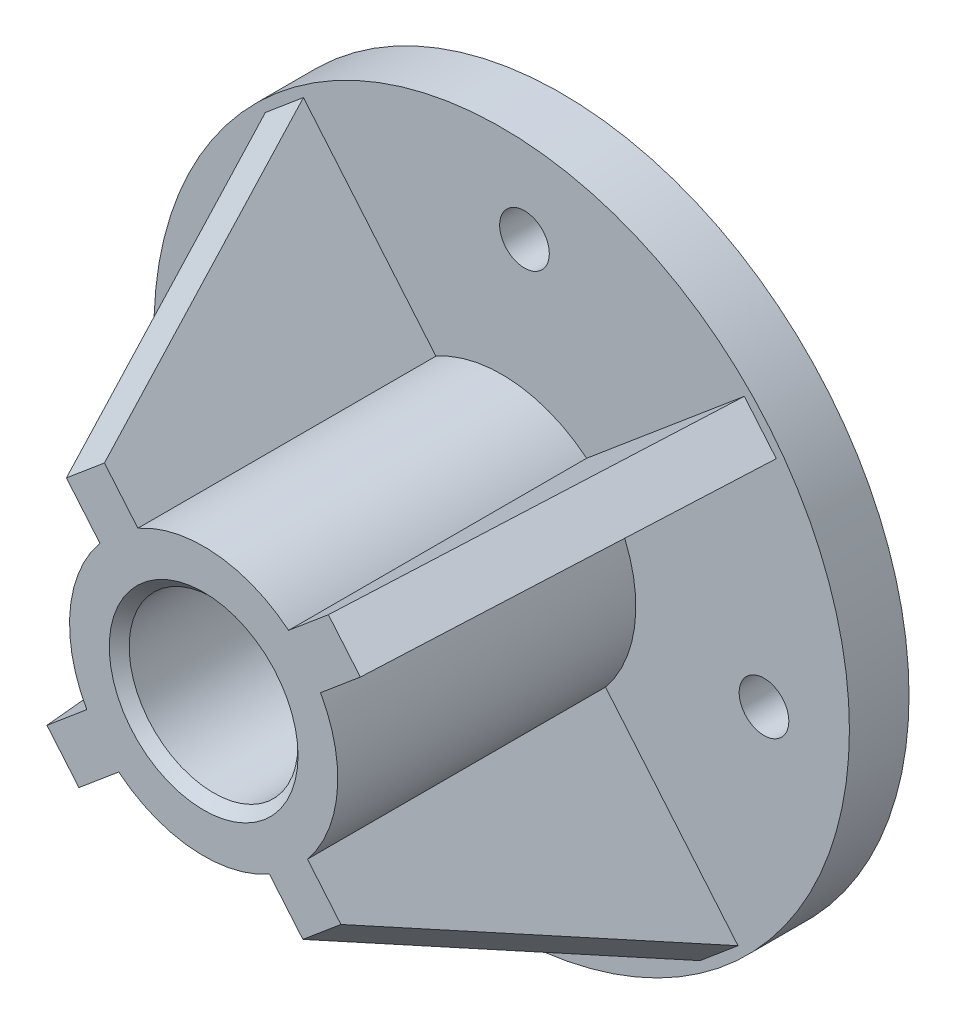
ISO-10303-21;
HEADER;
FILE_DESCRIPTION(('STEP AP214'),'2;1');
FILE_NAME('part.step','',(''),(''),'','','');
FILE_SCHEMA(('AUTOMOTIVE_DESIGN { 1 0 10303 214 1 1 1 1 }'));
ENDSEC;
DATA;
#1=APPLICATION_CONTEXT('core data for automotive mechanical design processes');
#2=APPLICATION_PROTOCOL_DEFINITION('international standard','automotive_design',2000,#1);
#3=PRODUCT_CONTEXT('',#1,'mechanical');
#4=PRODUCT('Part','Part','',(#3));
#5=PRODUCT_RELATED_PRODUCT_CATEGORY('part','',(#4));
#6=PRODUCT_DEFINITION_FORMATION('','',#4);
#7=PRODUCT_DEFINITION_CONTEXT('part definition',#1,'design');
#8=PRODUCT_DEFINITION('design','',#6,#7);
#9=PRODUCT_DEFINITION_SHAPE('','',#8);
#10=(LENGTH_UNIT() NAMED_UNIT(*) SI_UNIT(.MILLI.,.METRE.));
#11=(NAMED_UNIT(*) PLANE_ANGLE_UNIT() SI_UNIT($,.RADIAN.));
#12=(NAMED_UNIT(*) SI_UNIT($,.STERADIAN.) SOLID_ANGLE_UNIT());
#13=UNCERTAINTY_MEASURE_WITH_UNIT(LENGTH_MEASURE(1.E-05),#10,'distance_accuracy_value','');
#14=(GEOMETRIC_REPRESENTATION_CONTEXT(3) GLOBAL_UNCERTAINTY_ASSIGNED_CONTEXT((#13)) GLOBAL_UNIT_ASSIGNED_CONTEXT((#10,
#11,#12)) REPRESENTATION_CONTEXT('',''));
#15=CARTESIAN_POINT('',(0.,0.,0.));
#16=DIRECTION('',(0.,0.,1.));
#17=DIRECTION('',(1.,0.,0.));
#18=AXIS2_PLACEMENT_3D('',#15,#16,#17);
#19=CARTESIAN_POINT('',(-80.4513071380661,19.9438114333861,6.));
#20=DIRECTION('',(0.,0.,1.));
#21=DIRECTION('',(1.,0.,0.));
#22=AXIS2_PLACEMENT_3D('',#19,#20,#21);
#23=PLANE('',#22);
#24=CARTESIAN_POINT('',(-78.159933960489,46.3445615924456,6.));
#25=DIRECTION('',(0.,0.,1.));
#26=DIRECTION('',(0.,-1.,0.));
#27=AXIS2_PLACEMENT_3D('',#24,#25,#26);
#28=CIRCLE('',#27,2.5);
#29=CARTESIAN_POINT('',(-78.1599339604891,43.8445615924456,6.));
#30=VERTEX_POINT('',#29);
#31=EDGE_CURVE('E195',#30,#30,#28,.T.);
#32=ORIENTED_EDGE('',*,*,#31,.F.);
#33=EDGE_LOOP('',(#32));
#34=FACE_BOUND('',#33,.T.);
#35=CARTESIAN_POINT('',(-54.0505569790066,17.6524382558091,6.));
#36=DIRECTION('',(0.,0.,1.));
#37=DIRECTION('',(-1.,0.,0.));
#38=AXIS2_PLACEMENT_3D('',#35,#36,#37);
#39=CIRCLE('',#38,2.5);
#40=CARTESIAN_POINT('',(-56.5505569790066,17.6524382558091,6.));
#41=VERTEX_POINT('',#40);
#42=EDGE_CURVE('E577',#41,#41,#39,.T.);
#43=ORIENTED_EDGE('',*,*,#42,.F.);
#44=EDGE_LOOP('',(#43));
#45=FACE_BOUND('',#44,.T.);
#46=CARTESIAN_POINT('',(-82.7426803156434,-6.45693872567335,6.));
#47=DIRECTION('',(0.,0.,1.));
#48=DIRECTION('',(0.,1.,0.));
#49=AXIS2_PLACEMENT_3D('',#46,#47,#48);
#50=CIRCLE('',#49,2.5);
#51=CARTESIAN_POINT('',(-82.7426803156434,-3.95693872567335,6.));
#52=VERTEX_POINT('',#51);
#53=EDGE_CURVE('E208',#52,#52,#50,.T.);
#54=ORIENTED_EDGE('',*,*,#53,.F.);
#55=EDGE_LOOP('',(#54));
#56=FACE_BOUND('',#55,.T.);
#57=CARTESIAN_POINT('',(-106.852057297126,22.2351846109631,6.));
#58=DIRECTION('',(0.,0.,1.));
#59=DIRECTION('',(1.,0.,0.));
#60=AXIS2_PLACEMENT_3D('',#57,#58,#59);
#61=CIRCLE('',#60,2.5);
#62=CARTESIAN_POINT('',(-104.352057297126,22.2351846109631,6.));
#63=VERTEX_POINT('',#62);
#64=EDGE_CURVE('E191',#63,#63,#61,.T.);
#65=ORIENTED_EDGE('',*,*,#64,.F.);
#66=EDGE_LOOP('',(#65));
#67=FACE_BOUND('',#66,.T.);
#68=CARTESIAN_POINT('',(-80.4513071380661,19.9438114333861,6.));
#69=DIRECTION('',(0.,0.,1.));
#70=DIRECTION('',(1.,0.,0.));
#71=AXIS2_PLACEMENT_3D('',#68,#69,#70);
#72=CIRCLE('',#71,35.);
#73=CARTESIAN_POINT('',(-45.4513071380661,19.9438114333861,6.));
#74=VERTEX_POINT('',#73);
#75=EDGE_CURVE('E277',#74,#74,#72,.T.);
#76=ORIENTED_EDGE('',*,*,#75,.T.);
#77=EDGE_LOOP('',(#76));
#78=FACE_BOUND('',#77,.T.);
#79=DIRECTION('',(-0.643317130331662,0.765599810489681,0.));
#80=VECTOR('',#79,1.);
#81=CARTESIAN_POINT('',(-52.8126207555878,39.9025943384384,6.));
#82=LINE('',#81,#80);
#83=CARTESIAN_POINT('',(-52.8126207555878,39.9025943384384,6.));
#84=VERTEX_POINT('',#83);
#85=CARTESIAN_POINT('',(-56.0292064072461,43.7305933908868,6.));
#86=VERTEX_POINT('',#85);
#87=EDGE_CURVE('E171',#84,#86,#82,.T.);
#88=ORIENTED_EDGE('',*,*,#87,.F.);
#89=DIRECTION('',(0.765599810489681,0.643317130331662,0.));
#90=VECTOR('',#89,1.);
#91=CARTESIAN_POINT('',(-70.1198582657561,25.3596931824303,6.));
#92=LINE('',#91,#90);
#93=CARTESIAN_POINT('',(-68.6861850683911,26.5643780772351,6.));
#94=VERTEX_POINT('',#93);
#95=EDGE_CURVE('E163',#94,#84,#92,.T.);
#96=ORIENTED_EDGE('',*,*,#95,.F.);
#97=CARTESIAN_POINT('',(-80.4513071380661,19.9438114333861,6.));
#98=DIRECTION('',(0.,0.,1.));
#99=DIRECTION('',(1.,0.,0.));
#100=AXIS2_PLACEMENT_3D('',#97,#98,#99);
#101=CIRCLE('',#100,13.5);
#102=CARTESIAN_POINT('',(-70.0027414417687,11.3952750153695,6.));
#103=VERTEX_POINT('',#102);
#104=EDGE_CURVE('E274',#103,#94,#101,.T.);
#105=ORIENTED_EDGE('',*,*,#104,.F.);
#106=DIRECTION('',(-0.64331713033167,0.765599810489675,0.));
#107=VECTOR('',#106,1.);
#108=CARTESIAN_POINT('',(-71.2074263365734,12.8289482127345,6.));
#109=LINE('',#108,#107);
#110=CARTESIAN_POINT('',(-56.6645251805652,-4.47828929743362,6.));
#111=VERTEX_POINT('',#110);
#112=EDGE_CURVE('E260',#111,#103,#109,.T.);
#113=ORIENTED_EDGE('',*,*,#112,.F.);
#114=DIRECTION('',(0.765599810489675,0.64331713033167,0.));
#115=VECTOR('',#114,1.);
#116=CARTESIAN_POINT('',(-60.4925242330135,-7.69487494909196,6.));
#117=LINE('',#116,#115);
#118=CARTESIAN_POINT('',(-60.4925242330135,-7.69487494909196,6.));
#119=VERTEX_POINT('',#118);
#120=EDGE_CURVE('E264',#119,#111,#117,.T.);
#121=ORIENTED_EDGE('',*,*,#120,.F.);
#122=DIRECTION('',(0.64331713033167,-0.765599810489674,0.));
#123=VECTOR('',#122,1.);
#124=CARTESIAN_POINT('',(-75.0354253890218,9.61236256107618,6.));
#125=LINE('',#124,#123);
#126=CARTESIAN_POINT('',(-73.8307404942171,8.17868936371117,6.));
#127=VERTEX_POINT('',#126);
#128=EDGE_CURVE('E255',#127,#119,#125,.T.);
#129=ORIENTED_EDGE('',*,*,#128,.F.);
#130=CARTESIAN_POINT('',(-88.9998435560828,9.49524573708873,6.));
#131=VERTEX_POINT('',#130);
#132=EDGE_CURVE('E262',#131,#127,#101,.T.);
#133=ORIENTED_EDGE('',*,*,#132,.F.);
#134=DIRECTION('',(0.765599810489677,0.643317130331667,0.));
#135=VECTOR('',#134,1.);
#136=CARTESIAN_POINT('',(-87.5661703587178,10.6999306318935,6.));
#137=LINE('',#136,#135);
#138=CARTESIAN_POINT('',(-104.873407868886,-3.84297052411475,6.));
#139=VERTEX_POINT('',#138);
#140=EDGE_CURVE('E242',#139,#131,#137,.T.);
#141=ORIENTED_EDGE('',*,*,#140,.F.);
#142=DIRECTION('',(0.643317130331667,-0.765599810489677,0.));
#143=VECTOR('',#142,1.);
#144=CARTESIAN_POINT('',(-108.089993520544,-0.0149714716663613,6.));
#145=LINE('',#144,#143);
#146=CARTESIAN_POINT('',(-108.089993520544,-0.0149714716663613,6.));
#147=VERTEX_POINT('',#146);
#148=EDGE_CURVE('E246',#147,#139,#145,.T.);
#149=ORIENTED_EDGE('',*,*,#148,.F.);
#150=DIRECTION('',(-0.765599810489677,-0.643317130331667,0.));
#151=VECTOR('',#150,1.);
#152=CARTESIAN_POINT('',(-90.7827560103761,14.5279296843419,6.));
#153=LINE('',#152,#151);
#154=CARTESIAN_POINT('',(-92.2164292077411,13.3232447895371,6.));
#155=VERTEX_POINT('',#154);
#156=EDGE_CURVE('E237',#155,#147,#153,.T.);
#157=ORIENTED_EDGE('',*,*,#156,.F.);
#158=CARTESIAN_POINT('',(-90.8998728343636,28.4923478514028,6.));
#159=VERTEX_POINT('',#158);
#160=EDGE_CURVE('E336',#159,#155,#101,.T.);
#161=ORIENTED_EDGE('',*,*,#160,.F.);
#162=DIRECTION('',(0.64331713033167,-0.765599810489675,0.));
#163=VECTOR('',#162,1.);
#164=CARTESIAN_POINT('',(-89.6951879395588,27.0586746540377,6.));
#165=LINE('',#164,#163);
#166=CARTESIAN_POINT('',(-104.238089095567,44.3659121642059,6.));
#167=VERTEX_POINT('',#166);
#168=EDGE_CURVE('E224',#167,#159,#165,.T.);
#169=ORIENTED_EDGE('',*,*,#168,.F.);
#170=DIRECTION('',(-0.765599810489675,-0.64331713033167,0.));
#171=VECTOR('',#170,1.);
#172=CARTESIAN_POINT('',(-100.410090043119,47.5824978158642,6.));
#173=LINE('',#172,#171);
#174=CARTESIAN_POINT('',(-100.410090043119,47.5824978158642,6.));
#175=VERTEX_POINT('',#174);
#176=EDGE_CURVE('E228',#175,#167,#173,.T.);
#177=ORIENTED_EDGE('',*,*,#176,.F.);
#178=DIRECTION('',(-0.64331713033167,0.765599810489674,0.));
#179=VECTOR('',#178,1.);
#180=CARTESIAN_POINT('',(-85.8671888871105,30.2752603056961,6.));
#181=LINE('',#180,#179);
#182=CARTESIAN_POINT('',(-87.0718737819152,31.7089335030611,6.));
#183=VERTEX_POINT('',#182);
#184=EDGE_CURVE('E219',#183,#175,#181,.T.);
#185=ORIENTED_EDGE('',*,*,#184,.F.);
#186=CARTESIAN_POINT('',(-71.9027707200494,30.3923771296835,6.));
#187=VERTEX_POINT('',#186);
#188=EDGE_CURVE('E276',#187,#183,#101,.T.);
#189=ORIENTED_EDGE('',*,*,#188,.F.);
#190=DIRECTION('',(-0.765599810489681,-0.643317130331662,0.));
#191=VECTOR('',#190,1.);
#192=CARTESIAN_POINT('',(-73.3364439174144,29.1876922348788,6.));
#193=LINE('',#192,#191);
#194=EDGE_CURVE('E176',#86,#187,#193,.T.);
#195=ORIENTED_EDGE('',*,*,#194,.F.);
#196=EDGE_LOOP('',(#88,#96,#105,#113,#121,#129,#133,#141,#149,#157,#161,#169,#177,#185,#189,#195));
#197=FACE_BOUND('',#196,.T.);
#198=ADVANCED_FACE('F49',(#34,#45,#56,#67,#78,#197),#23,.T.);
#199=CARTESIAN_POINT('',(-80.4513071380661,19.9438114333861,36.));
#200=DIRECTION('',(0.,0.,-1.));
#201=DIRECTION('',(-1.,0.,0.));
#202=AXIS2_PLACEMENT_3D('',#199,#200,#201);
#203=CYLINDRICAL_SURFACE('',#202,13.5);
#204=DIRECTION('',(0.,0.,-1.));
#205=VECTOR('',#204,1.);
#206=CARTESIAN_POINT('',(-68.6861850683911,26.5643780772351,36.));
#207=LINE('',#206,#205);
#208=CARTESIAN_POINT('',(-68.6861850683911,26.5643780772351,36.));
#209=VERTEX_POINT('',#208);
#210=EDGE_CURVE('E167',#209,#94,#207,.T.);
#211=ORIENTED_EDGE('',*,*,#210,.F.);
#212=CARTESIAN_POINT('',(-80.4513071380661,19.9438114333861,36.));
#213=DIRECTION('',(0.,0.,1.));
#214=DIRECTION('',(1.,0.,0.));
#215=AXIS2_PLACEMENT_3D('',#212,#213,#214);
#216=CIRCLE('',#215,13.5);
#217=CARTESIAN_POINT('',(-70.0027414417687,11.3952750153695,36.));
#218=VERTEX_POINT('',#217);
#219=EDGE_CURVE('E268',#218,#209,#216,.T.);
#220=ORIENTED_EDGE('',*,*,#219,.F.);
#221=DIRECTION('',(0.,0.,-1.));
#222=VECTOR('',#221,1.);
#223=CARTESIAN_POINT('',(-70.0027414417687,11.3952750153695,36.));
#224=LINE('',#223,#222);
#225=EDGE_CURVE('E280',#103,#218,#224,.F.);
#226=ORIENTED_EDGE('',*,*,#225,.F.);
#227=ORIENTED_EDGE('',*,*,#104,.T.);
#228=EDGE_LOOP('',(#211,#220,#226,#227));
#229=FACE_BOUND('',#228,.T.);
#230=ADVANCED_FACE('F374',(#229),#203,.T.);
#231=DIRECTION('',(0.,0.,-1.));
#232=VECTOR('',#231,1.);
#233=CARTESIAN_POINT('',(-71.9027707200494,30.3923771296835,36.));
#234=LINE('',#233,#232);
#235=CARTESIAN_POINT('',(-71.9027707200494,30.3923771296835,36.));
#236=VERTEX_POINT('',#235);
#237=EDGE_CURVE('E213',#187,#236,#234,.F.);
#238=ORIENTED_EDGE('',*,*,#237,.F.);
#239=ORIENTED_EDGE('',*,*,#188,.T.);
#240=DIRECTION('',(0.,0.,-1.));
#241=VECTOR('',#240,1.);
#242=CARTESIAN_POINT('',(-87.0718737819152,31.7089335030611,36.));
#243=LINE('',#242,#241);
#244=CARTESIAN_POINT('',(-87.0718737819152,31.7089335030611,36.));
#245=VERTEX_POINT('',#244);
#246=EDGE_CURVE('E234',#245,#183,#243,.T.);
#247=ORIENTED_EDGE('',*,*,#246,.F.);
#248=EDGE_CURVE('E272',#236,#245,#216,.T.);
#249=ORIENTED_EDGE('',*,*,#248,.F.);
#250=EDGE_LOOP('',(#238,#239,#247,#249));
#251=FACE_BOUND('',#250,.T.);
#252=ADVANCED_FACE('F317',(#251),#203,.T.);
#253=DIRECTION('',(0.,0.,-1.));
#254=VECTOR('',#253,1.);
#255=CARTESIAN_POINT('',(-90.8998728343636,28.4923478514028,36.));
#256=LINE('',#255,#254);
#257=CARTESIAN_POINT('',(-90.8998728343636,28.4923478514028,36.));
#258=VERTEX_POINT('',#257);
#259=EDGE_CURVE('E226',#159,#258,#256,.F.);
#260=ORIENTED_EDGE('',*,*,#259,.F.);
#261=ORIENTED_EDGE('',*,*,#160,.T.);
#262=DIRECTION('',(0.,0.,-1.));
#263=VECTOR('',#262,1.);
#264=CARTESIAN_POINT('',(-92.2164292077411,13.3232447895371,36.));
#265=LINE('',#264,#263);
#266=CARTESIAN_POINT('',(-92.2164292077411,13.3232447895371,36.));
#267=VERTEX_POINT('',#266);
#268=EDGE_CURVE('E252',#267,#155,#265,.T.);
#269=ORIENTED_EDGE('',*,*,#268,.F.);
#270=EDGE_CURVE('E319',#258,#267,#216,.T.);
#271=ORIENTED_EDGE('',*,*,#270,.F.);
#272=EDGE_LOOP('',(#260,#261,#269,#271));
#273=FACE_BOUND('',#272,.T.);
#274=ADVANCED_FACE('F353',(#273),#203,.T.);
#275=DIRECTION('',(0.,0.,-1.));
#276=VECTOR('',#275,1.);
#277=CARTESIAN_POINT('',(-88.9998435560828,9.49524573708874,36.));
#278=LINE('',#277,#276);
#279=CARTESIAN_POINT('',(-88.9998435560828,9.49524573708873,36.));
#280=VERTEX_POINT('',#279);
#281=EDGE_CURVE('E244',#131,#280,#278,.F.);
#282=ORIENTED_EDGE('',*,*,#281,.F.);
#283=ORIENTED_EDGE('',*,*,#132,.T.);
#284=DIRECTION('',(0.,0.,-1.));
#285=VECTOR('',#284,1.);
#286=CARTESIAN_POINT('',(-73.8307404942171,8.17868936371117,36.));
#287=LINE('',#286,#285);
#288=CARTESIAN_POINT('',(-73.8307404942171,8.17868936371117,36.));
#289=VERTEX_POINT('',#288);
#290=EDGE_CURVE('E285',#289,#127,#287,.T.);
#291=ORIENTED_EDGE('',*,*,#290,.F.);
#292=EDGE_CURVE('E273',#280,#289,#216,.T.);
#293=ORIENTED_EDGE('',*,*,#292,.F.);
#294=EDGE_LOOP('',(#282,#283,#291,#293));
#295=FACE_BOUND('',#294,.T.);
#296=ADVANCED_FACE('F333',(#295),#203,.T.);
#297=CARTESIAN_POINT('',(-80.4513071380661,19.9438114333861,6.));
#298=DIRECTION('',(0.,0.,-1.));
#299=DIRECTION('',(-1.,0.,0.));
#300=AXIS2_PLACEMENT_3D('',#297,#298,#299);
#301=CYLINDRICAL_SURFACE('',#300,35.);
#302=ORIENTED_EDGE('',*,*,#75,.F.);
#303=EDGE_LOOP('',(#302));
#304=FACE_BOUND('',#303,.T.);
#305=CARTESIAN_POINT('',(-80.4513071380661,19.9438114333861,0.));
#306=DIRECTION('',(0.,0.,1.));
#307=DIRECTION('',(1.,0.,0.));
#308=AXIS2_PLACEMENT_3D('',#305,#306,#307);
#309=CIRCLE('',#308,35.);
#310=CARTESIAN_POINT('',(-45.4513071380661,19.9438114333861,0.));
#311=VERTEX_POINT('',#310);
#312=EDGE_CURVE('E271',#311,#311,#309,.T.);
#313=ORIENTED_EDGE('',*,*,#312,.T.);
#314=EDGE_LOOP('',(#313));
#315=FACE_BOUND('',#314,.T.);
#316=ADVANCED_FACE('F389',(#304,#315),#301,.T.);
#317=CARTESIAN_POINT('',(-80.4513071380661,19.9438114333861,0.));
#318=DIRECTION('',(0.,0.,1.));
#319=DIRECTION('',(1.,0.,0.));
#320=AXIS2_PLACEMENT_3D('',#317,#318,#319);
#321=PLANE('',#320);
#322=CARTESIAN_POINT('',(-78.159933960489,46.3445615924456,0.));
#323=DIRECTION('',(0.,0.,1.));
#324=DIRECTION('',(1.,0.,0.));
#325=AXIS2_PLACEMENT_3D('',#322,#323,#324);
#326=CIRCLE('',#325,2.5);
#327=CARTESIAN_POINT('',(-75.659933960489,46.3445615924456,0.));
#328=VERTEX_POINT('',#327);
#329=EDGE_CURVE('E53',#328,#328,#326,.T.);
#330=ORIENTED_EDGE('',*,*,#329,.T.);
#331=EDGE_LOOP('',(#330));
#332=FACE_BOUND('',#331,.T.);
#333=CARTESIAN_POINT('',(-54.0505569790066,17.6524382558091,0.));
#334=DIRECTION('',(0.,0.,1.));
#335=DIRECTION('',(1.,0.,0.));
#336=AXIS2_PLACEMENT_3D('',#333,#334,#335);
#337=CIRCLE('',#336,2.5);
#338=CARTESIAN_POINT('',(-51.5505569790066,17.6524382558091,0.));
#339=VERTEX_POINT('',#338);
#340=EDGE_CURVE('E194',#339,#339,#337,.T.);
#341=ORIENTED_EDGE('',*,*,#340,.T.);
#342=EDGE_LOOP('',(#341));
#343=FACE_BOUND('',#342,.T.);
#344=CARTESIAN_POINT('',(-82.7426803156434,-6.45693872567335,0.));
#345=DIRECTION('',(0.,0.,1.));
#346=DIRECTION('',(1.,0.,0.));
#347=AXIS2_PLACEMENT_3D('',#344,#345,#346);
#348=CIRCLE('',#347,2.5);
#349=CARTESIAN_POINT('',(-80.2426803156434,-6.45693872567335,0.));
#350=VERTEX_POINT('',#349);
#351=EDGE_CURVE('E192',#350,#350,#348,.T.);
#352=ORIENTED_EDGE('',*,*,#351,.T.);
#353=EDGE_LOOP('',(#352));
#354=FACE_BOUND('',#353,.T.);
#355=CARTESIAN_POINT('',(-106.852057297126,22.2351846109631,0.));
#356=DIRECTION('',(0.,0.,1.));
#357=DIRECTION('',(1.,0.,0.));
#358=AXIS2_PLACEMENT_3D('',#355,#356,#357);
#359=CIRCLE('',#358,2.5);
#360=CARTESIAN_POINT('',(-104.352057297126,22.2351846109631,0.));
#361=VERTEX_POINT('',#360);
#362=EDGE_CURVE('E187',#361,#361,#359,.T.);
#363=ORIENTED_EDGE('',*,*,#362,.T.);
#364=EDGE_LOOP('',(#363));
#365=FACE_BOUND('',#364,.T.);
#366=CARTESIAN_POINT('',(-80.4513071380661,19.9438114333861,0.));
#367=DIRECTION('',(0.,0.,1.));
#368=DIRECTION('',(1.,0.,0.));
#369=AXIS2_PLACEMENT_3D('',#366,#367,#368);
#370=CIRCLE('',#369,8.5);
#371=CARTESIAN_POINT('',(-71.9513071380661,19.9438114333861,0.));
#372=VERTEX_POINT('',#371);
#373=EDGE_CURVE('E172',#372,#372,#370,.T.);
#374=ORIENTED_EDGE('',*,*,#373,.T.);
#375=EDGE_LOOP('',(#374));
#376=FACE_BOUND('',#375,.T.);
#377=ORIENTED_EDGE('',*,*,#312,.F.);
#378=EDGE_LOOP('',(#377));
#379=FACE_BOUND('',#378,.T.);
#380=ADVANCED_FACE('F386',(#332,#343,#354,#365,#376,#379),#321,.F.);
#381=CARTESIAN_POINT('',(-80.4513071380661,19.9438114333861,36.));
#382=DIRECTION('',(0.,0.,1.));
#383=DIRECTION('',(1.,0.,0.));
#384=AXIS2_PLACEMENT_3D('',#381,#382,#383);
#385=PLANE('',#384);
#386=CARTESIAN_POINT('',(-80.4513071380661,19.9438114333861,36.));
#387=DIRECTION('',(0.,0.,1.));
#388=DIRECTION('',(1.,0.,0.));
#389=AXIS2_PLACEMENT_3D('',#386,#387,#388);
#390=CIRCLE('',#389,9.50000000000005);
#391=CARTESIAN_POINT('',(-70.9513071380661,19.9438114333861,36.));
#392=VERTEX_POINT('',#391);
#393=EDGE_CURVE('E13',#392,#392,#390,.F.);
#394=ORIENTED_EDGE('',*,*,#393,.T.);
#395=EDGE_LOOP('',(#394));
#396=FACE_BOUND('',#395,.T.);
#397=DIRECTION('',(0.765599810489681,0.643317130331662,0.));
#398=VECTOR('',#397,1.);
#399=CARTESIAN_POINT('',(-70.1198582657561,25.3596931824303,36.));
#400=LINE('',#399,#398);
#401=CARTESIAN_POINT('',(-64.6794178181779,29.9311788182977,36.));
#402=VERTEX_POINT('',#401);
#403=EDGE_CURVE('E210',#209,#402,#400,.T.);
#404=ORIENTED_EDGE('',*,*,#403,.T.);
#405=DIRECTION('',(-0.643317130331662,0.765599810489681,0.));
#406=VECTOR('',#405,1.);
#407=CARTESIAN_POINT('',(-67.8960034698362,33.7591778707461,36.));
#408=LINE('',#407,#406);
#409=CARTESIAN_POINT('',(-67.8960034698362,33.7591778707461,36.));
#410=VERTEX_POINT('',#409);
#411=EDGE_CURVE('E179',#402,#410,#408,.T.);
#412=ORIENTED_EDGE('',*,*,#411,.T.);
#413=DIRECTION('',(-0.765599810489681,-0.643317130331662,0.));
#414=VECTOR('',#413,1.);
#415=CARTESIAN_POINT('',(-73.3364439174144,29.1876922348788,36.));
#416=LINE('',#415,#414);
#417=EDGE_CURVE('E212',#410,#236,#416,.T.);
#418=ORIENTED_EDGE('',*,*,#417,.T.);
#419=ORIENTED_EDGE('',*,*,#248,.T.);
#420=DIRECTION('',(-0.64331713033167,0.765599810489674,0.));
#421=VECTOR('',#420,1.);
#422=CARTESIAN_POINT('',(-85.8671888871105,30.2752603056961,36.));
#423=LINE('',#422,#421);
#424=CARTESIAN_POINT('',(-90.4386745229778,35.7157007532743,36.));
#425=VERTEX_POINT('',#424);
#426=EDGE_CURVE('E220',#245,#425,#423,.T.);
#427=ORIENTED_EDGE('',*,*,#426,.T.);
#428=DIRECTION('',(-0.765599810489675,-0.64331713033167,0.));
#429=VECTOR('',#428,1.);
#430=CARTESIAN_POINT('',(-94.2666735754262,32.4991151016159,36.));
#431=LINE('',#430,#429);
#432=CARTESIAN_POINT('',(-94.2666735754262,32.4991151016159,36.));
#433=VERTEX_POINT('',#432);
#434=EDGE_CURVE('E302',#425,#433,#431,.T.);
#435=ORIENTED_EDGE('',*,*,#434,.T.);
#436=DIRECTION('',(0.64331713033167,-0.765599810489675,0.));
#437=VECTOR('',#436,1.);
#438=CARTESIAN_POINT('',(-89.6951879395588,27.0586746540377,36.));
#439=LINE('',#438,#437);
#440=EDGE_CURVE('E223',#433,#258,#439,.T.);
#441=ORIENTED_EDGE('',*,*,#440,.T.);
#442=ORIENTED_EDGE('',*,*,#270,.T.);
#443=DIRECTION('',(-0.765599810489677,-0.643317130331667,0.));
#444=VECTOR('',#443,1.);
#445=CARTESIAN_POINT('',(-90.7827560103761,14.5279296843419,36.));
#446=LINE('',#445,#444);
#447=CARTESIAN_POINT('',(-96.2231964579543,9.95644404847449,36.));
#448=VERTEX_POINT('',#447);
#449=EDGE_CURVE('E238',#267,#448,#446,.T.);
#450=ORIENTED_EDGE('',*,*,#449,.T.);
#451=DIRECTION('',(0.643317130331667,-0.765599810489677,0.));
#452=VECTOR('',#451,1.);
#453=CARTESIAN_POINT('',(-93.006610806296,6.1284449960261,36.));
#454=LINE('',#453,#452);
#455=CARTESIAN_POINT('',(-93.006610806296,6.12844499602611,36.));
#456=VERTEX_POINT('',#455);
#457=EDGE_CURVE('E295',#448,#456,#454,.T.);
#458=ORIENTED_EDGE('',*,*,#457,.T.);
#459=DIRECTION('',(0.765599810489677,0.643317130331667,0.));
#460=VECTOR('',#459,1.);
#461=CARTESIAN_POINT('',(-87.5661703587178,10.6999306318935,36.));
#462=LINE('',#461,#460);
#463=EDGE_CURVE('E241',#456,#280,#462,.T.);
#464=ORIENTED_EDGE('',*,*,#463,.T.);
#465=ORIENTED_EDGE('',*,*,#292,.T.);
#466=DIRECTION('',(0.64331713033167,-0.765599810489674,0.));
#467=VECTOR('',#466,1.);
#468=CARTESIAN_POINT('',(-75.0354253890218,9.61236256107618,36.));
#469=LINE('',#468,#467);
#470=CARTESIAN_POINT('',(-70.4639397531544,4.17192211349801,36.));
#471=VERTEX_POINT('',#470);
#472=EDGE_CURVE('E256',#289,#471,#469,.T.);
#473=ORIENTED_EDGE('',*,*,#472,.T.);
#474=DIRECTION('',(0.765599810489675,0.64331713033167,0.));
#475=VECTOR('',#474,1.);
#476=CARTESIAN_POINT('',(-66.6359407007061,7.38850776515636,36.));
#477=LINE('',#476,#475);
#478=CARTESIAN_POINT('',(-66.6359407007061,7.38850776515636,36.));
#479=VERTEX_POINT('',#478);
#480=EDGE_CURVE('E288',#471,#479,#477,.T.);
#481=ORIENTED_EDGE('',*,*,#480,.T.);
#482=DIRECTION('',(-0.64331713033167,0.765599810489675,0.));
#483=VECTOR('',#482,1.);
#484=CARTESIAN_POINT('',(-71.2074263365734,12.8289482127345,36.));
#485=LINE('',#484,#483);
#486=EDGE_CURVE('E259',#479,#218,#485,.T.);
#487=ORIENTED_EDGE('',*,*,#486,.T.);
#488=ORIENTED_EDGE('',*,*,#219,.T.);
#489=EDGE_LOOP('',(#404,#412,#418,#419,#427,#435,#441,#442,#450,#458,#464,#465,#473,#481,#487,#488));
#490=FACE_BOUND('',#489,.T.);
#491=ADVANCED_FACE('F310',(#396,#490),#385,.T.);
#492=CARTESIAN_POINT('',(-80.4513071380661,19.9438114333861,36.));
#493=DIRECTION('',(0.,0.,-1.));
#494=DIRECTION('',(-1.,0.,0.));
#495=AXIS2_PLACEMENT_3D('',#492,#493,#494);
#496=CYLINDRICAL_SURFACE('',#495,8.50000000000001);
#497=CARTESIAN_POINT('',(-80.4513071380661,19.9438114333861,35.));
#498=DIRECTION('',(0.,0.,1.));
#499=DIRECTION('',(1.,0.,0.));
#500=AXIS2_PLACEMENT_3D('',#497,#498,#499);
#501=CIRCLE('',#500,8.50000000000001);
#502=CARTESIAN_POINT('',(-71.9513071380661,19.9438114333861,35.));
#503=VERTEX_POINT('',#502);
#504=EDGE_CURVE('E58',#503,#503,#501,.T.);
#505=ORIENTED_EDGE('',*,*,#504,.T.);
#506=EDGE_LOOP('',(#505));
#507=FACE_BOUND('',#506,.T.);
#508=ORIENTED_EDGE('',*,*,#373,.F.);
#509=EDGE_LOOP('',(#508));
#510=FACE_BOUND('',#509,.T.);
#511=ADVANCED_FACE('F415',(#507,#510),#496,.F.);
#512=CARTESIAN_POINT('',(-75.0354253890218,9.61236256107618,36.));
#513=DIRECTION('',(0.765599810489674,0.64331713033167,0.));
#514=DIRECTION('',(-0.64331713033167,0.765599810489674,0.));
#515=AXIS2_PLACEMENT_3D('',#512,#513,#514);
#516=PLANE('',#515);
#517=ORIENTED_EDGE('',*,*,#128,.T.);
#518=DIRECTION('',(-0.295295462537779,0.351425664727483,0.888425906857429));
#519=VECTOR('',#518,1.);
#520=CARTESIAN_POINT('',(-70.4639397531544,4.17192211349801,36.));
#521=LINE('',#520,#519);
#522=EDGE_CURVE('E293',#119,#471,#521,.T.);
#523=ORIENTED_EDGE('',*,*,#522,.T.);
#524=ORIENTED_EDGE('',*,*,#472,.F.);
#525=ORIENTED_EDGE('',*,*,#290,.T.);
#526=EDGE_LOOP('',(#517,#523,#524,#525));
#527=FACE_BOUND('',#526,.T.);
#528=ADVANCED_FACE('F330',(#527),#516,.F.);
#529=CARTESIAN_POINT('',(-71.2074263365734,12.8289482127345,36.));
#530=DIRECTION('',(-0.765599810489675,-0.64331713033167,0.));
#531=DIRECTION('',(0.64331713033167,-0.765599810489675,0.));
#532=AXIS2_PLACEMENT_3D('',#529,#530,#531);
#533=PLANE('',#532);
#534=ORIENTED_EDGE('',*,*,#486,.F.);
#535=DIRECTION('',(0.295295462537779,-0.351425664727484,-0.888425906857429));
#536=VECTOR('',#535,1.);
#537=CARTESIAN_POINT('',(-66.6359407007061,7.38850776515636,36.));
#538=LINE('',#537,#536);
#539=EDGE_CURVE('E291',#479,#111,#538,.T.);
#540=ORIENTED_EDGE('',*,*,#539,.T.);
#541=ORIENTED_EDGE('',*,*,#112,.T.);
#542=ORIENTED_EDGE('',*,*,#225,.T.);
#543=EDGE_LOOP('',(#534,#540,#541,#542));
#544=FACE_BOUND('',#543,.T.);
#545=ADVANCED_FACE('F395',(#544),#533,.F.);
#546=CARTESIAN_POINT('',(-68.5499402269303,5.78021493932718,36.));
#547=DIRECTION('',(0.571539604911833,-0.680178705924165,0.459020051876336));
#548=DIRECTION('',(-0.765599810489675,-0.64331713033167,0.));
#549=AXIS2_PLACEMENT_3D('',#546,#547,#548);
#550=PLANE('',#549);
#551=ORIENTED_EDGE('',*,*,#522,.F.);
#552=ORIENTED_EDGE('',*,*,#120,.T.);
#553=ORIENTED_EDGE('',*,*,#539,.F.);
#554=ORIENTED_EDGE('',*,*,#480,.F.);
#555=EDGE_LOOP('',(#551,#552,#553,#554));
#556=FACE_BOUND('',#555,.T.);
#557=ADVANCED_FACE('F371',(#556),#550,.T.);
#558=CARTESIAN_POINT('',(-90.7827560103761,14.5279296843419,36.));
#559=DIRECTION('',(0.643317130331667,-0.765599810489677,0.));
#560=DIRECTION('',(0.765599810489677,0.643317130331667,0.));
#561=AXIS2_PLACEMENT_3D('',#558,#559,#560);
#562=PLANE('',#561);
#563=ORIENTED_EDGE('',*,*,#156,.T.);
#564=DIRECTION('',(0.351425664727484,0.295295462537777,0.88842590685743));
#565=VECTOR('',#564,1.);
#566=CARTESIAN_POINT('',(-96.2231964579543,9.95644404847449,36.));
#567=LINE('',#566,#565);
#568=EDGE_CURVE('E300',#147,#448,#567,.T.);
#569=ORIENTED_EDGE('',*,*,#568,.T.);
#570=ORIENTED_EDGE('',*,*,#449,.F.);
#571=ORIENTED_EDGE('',*,*,#268,.T.);
#572=EDGE_LOOP('',(#563,#569,#570,#571));
#573=FACE_BOUND('',#572,.T.);
#574=ADVANCED_FACE('F356',(#573),#562,.F.);
#575=CARTESIAN_POINT('',(-87.5661703587178,10.6999306318935,36.));
#576=DIRECTION('',(-0.643317130331667,0.765599810489677,0.));
#577=DIRECTION('',(-0.765599810489677,-0.643317130331667,0.));
#578=AXIS2_PLACEMENT_3D('',#575,#576,#577);
#579=PLANE('',#578);
#580=ORIENTED_EDGE('',*,*,#463,.F.);
#581=DIRECTION('',(-0.351425664727484,-0.295295462537777,-0.88842590685743));
#582=VECTOR('',#581,1.);
#583=CARTESIAN_POINT('',(-93.006610806296,6.12844499602611,36.));
#584=LINE('',#583,#582);
#585=EDGE_CURVE('E298',#456,#139,#584,.T.);
#586=ORIENTED_EDGE('',*,*,#585,.T.);
#587=ORIENTED_EDGE('',*,*,#140,.T.);
#588=ORIENTED_EDGE('',*,*,#281,.T.);
#589=EDGE_LOOP('',(#580,#586,#587,#588));
#590=FACE_BOUND('',#589,.T.);
#591=ADVANCED_FACE('F363',(#590),#579,.F.);
#592=CARTESIAN_POINT('',(-85.8671888871105,30.2752603056961,36.));
#593=DIRECTION('',(-0.765599810489674,-0.64331713033167,0.));
#594=DIRECTION('',(0.64331713033167,-0.765599810489674,0.));
#595=AXIS2_PLACEMENT_3D('',#592,#593,#594);
#596=PLANE('',#595);
#597=ORIENTED_EDGE('',*,*,#184,.T.);
#598=DIRECTION('',(0.295295462537779,-0.351425664727484,0.888425906857429));
#599=VECTOR('',#598,1.);
#600=CARTESIAN_POINT('',(-90.4386745229778,35.7157007532743,36.));
#601=LINE('',#600,#599);
#602=EDGE_CURVE('E307',#175,#425,#601,.T.);
#603=ORIENTED_EDGE('',*,*,#602,.T.);
#604=ORIENTED_EDGE('',*,*,#426,.F.);
#605=ORIENTED_EDGE('',*,*,#246,.T.);
#606=EDGE_LOOP('',(#597,#603,#604,#605));
#607=FACE_BOUND('',#606,.T.);
#608=ADVANCED_FACE('F343',(#607),#596,.F.);
#609=CARTESIAN_POINT('',(-89.6951879395588,27.0586746540377,36.));
#610=DIRECTION('',(0.765599810489675,0.64331713033167,0.));
#611=DIRECTION('',(-0.64331713033167,0.765599810489675,0.));
#612=AXIS2_PLACEMENT_3D('',#609,#610,#611);
#613=PLANE('',#612);
#614=ORIENTED_EDGE('',*,*,#440,.F.);
#615=DIRECTION('',(-0.295295462537779,0.351425664727484,-0.888425906857429));
#616=VECTOR('',#615,1.);
#617=CARTESIAN_POINT('',(-94.2666735754262,32.4991151016159,36.));
#618=LINE('',#617,#616);
#619=EDGE_CURVE('E305',#433,#167,#618,.T.);
#620=ORIENTED_EDGE('',*,*,#619,.T.);
#621=ORIENTED_EDGE('',*,*,#168,.T.);
#622=ORIENTED_EDGE('',*,*,#259,.T.);
#623=EDGE_LOOP('',(#614,#620,#621,#622));
#624=FACE_BOUND('',#623,.T.);
#625=ADVANCED_FACE('F352',(#624),#613,.F.);
#626=CARTESIAN_POINT('',(-70.1198582657561,25.3596931824303,36.));
#627=DIRECTION('',(-0.643317130331662,0.765599810489681,0.));
#628=DIRECTION('',(-0.765599810489681,-0.643317130331662,0.));
#629=AXIS2_PLACEMENT_3D('',#626,#627,#628);
#630=PLANE('',#629);
#631=ORIENTED_EDGE('',*,*,#95,.T.);
#632=DIRECTION('',(-0.351425664727487,-0.295295462537775,0.888425906857429));
#633=VECTOR('',#632,1.);
#634=CARTESIAN_POINT('',(-64.6794178181779,29.9311788182977,36.));
#635=LINE('',#634,#633);
#636=EDGE_CURVE('E74',#84,#402,#635,.T.);
#637=ORIENTED_EDGE('',*,*,#636,.T.);
#638=ORIENTED_EDGE('',*,*,#403,.F.);
#639=ORIENTED_EDGE('',*,*,#210,.T.);
#640=EDGE_LOOP('',(#631,#637,#638,#639));
#641=FACE_BOUND('',#640,.T.);
#642=ADVANCED_FACE('F165',(#641),#630,.F.);
#643=CARTESIAN_POINT('',(-73.3364439174144,29.1876922348788,36.));
#644=DIRECTION('',(0.643317130331662,-0.765599810489681,0.));
#645=DIRECTION('',(0.765599810489681,0.643317130331662,0.));
#646=AXIS2_PLACEMENT_3D('',#643,#644,#645);
#647=PLANE('',#646);
#648=ORIENTED_EDGE('',*,*,#417,.F.);
#649=DIRECTION('',(0.351425664727487,0.295295462537775,-0.888425906857429));
#650=VECTOR('',#649,1.);
#651=CARTESIAN_POINT('',(-67.8960034698362,33.7591778707461,36.));
#652=LINE('',#651,#650);
#653=EDGE_CURVE('E66',#410,#86,#652,.T.);
#654=ORIENTED_EDGE('',*,*,#653,.T.);
#655=ORIENTED_EDGE('',*,*,#194,.T.);
#656=ORIENTED_EDGE('',*,*,#237,.T.);
#657=EDGE_LOOP('',(#648,#654,#655,#656));
#658=FACE_BOUND('',#657,.T.);
#659=ADVANCED_FACE('F312',(#658),#647,.F.);
#660=CARTESIAN_POINT('',(-94.6149036321252,8.04244452225031,36.));
#661=DIRECTION('',(-0.680178705924167,-0.571539604911831,0.459020051876336));
#662=DIRECTION('',(-0.643317130331667,0.765599810489677,0.));
#663=AXIS2_PLACEMENT_3D('',#660,#661,#662);
#664=PLANE('',#663);
#665=ORIENTED_EDGE('',*,*,#568,.F.);
#666=ORIENTED_EDGE('',*,*,#148,.T.);
#667=ORIENTED_EDGE('',*,*,#585,.F.);
#668=ORIENTED_EDGE('',*,*,#457,.F.);
#669=EDGE_LOOP('',(#665,#666,#667,#668));
#670=FACE_BOUND('',#669,.T.);
#671=ADVANCED_FACE('F361',(#670),#664,.T.);
#672=CARTESIAN_POINT('',(-92.352674049202,34.1074079274451,36.));
#673=DIRECTION('',(-0.571539604911833,0.680178705924165,0.459020051876336));
#674=DIRECTION('',(0.765599810489675,0.64331713033167,0.));
#675=AXIS2_PLACEMENT_3D('',#672,#673,#674);
#676=PLANE('',#675);
#677=ORIENTED_EDGE('',*,*,#602,.F.);
#678=ORIENTED_EDGE('',*,*,#176,.T.);
#679=ORIENTED_EDGE('',*,*,#619,.F.);
#680=ORIENTED_EDGE('',*,*,#434,.F.);
#681=EDGE_LOOP('',(#677,#678,#679,#680));
#682=FACE_BOUND('',#681,.T.);
#683=ADVANCED_FACE('F349',(#682),#676,.T.);
#684=CARTESIAN_POINT('',(-66.2877106440071,31.8451783445219,36.));
#685=DIRECTION('',(0.680178705924171,0.571539604911825,0.459020051876336));
#686=DIRECTION('',(0.643317130331662,-0.765599810489681,0.));
#687=AXIS2_PLACEMENT_3D('',#684,#685,#686);
#688=PLANE('',#687);
#689=ORIENTED_EDGE('',*,*,#636,.F.);
#690=ORIENTED_EDGE('',*,*,#87,.T.);
#691=ORIENTED_EDGE('',*,*,#653,.F.);
#692=ORIENTED_EDGE('',*,*,#411,.F.);
#693=EDGE_LOOP('',(#689,#690,#691,#692));
#694=FACE_BOUND('',#693,.T.);
#695=ADVANCED_FACE('F178',(#694),#688,.T.);
#696=CARTESIAN_POINT('',(-80.4513071380661,19.9438114333861,35.));
#697=DIRECTION('',(0.,0.,1.));
#698=DIRECTION('',(1.,0.,0.));
#699=AXIS2_PLACEMENT_3D('',#696,#697,#698);
#700=CONICAL_SURFACE('',#699,8.50000000000001,0.785398163397454);
#701=ORIENTED_EDGE('',*,*,#393,.F.);
#702=EDGE_LOOP('',(#701));
#703=FACE_BOUND('',#702,.T.);
#704=ORIENTED_EDGE('',*,*,#504,.F.);
#705=EDGE_LOOP('',(#704));
#706=FACE_BOUND('',#705,.T.);
#707=ADVANCED_FACE('F51',(#703,#706),#700,.F.);
#708=CARTESIAN_POINT('',(-106.852057297126,22.2351846109631,-24.));
#709=DIRECTION('',(0.,0.,1.));
#710=DIRECTION('',(1.,0.,0.));
#711=AXIS2_PLACEMENT_3D('',#708,#709,#710);
#712=CYLINDRICAL_SURFACE('',#711,2.5);
#713=ORIENTED_EDGE('',*,*,#64,.T.);
#714=EDGE_LOOP('',(#713));
#715=FACE_BOUND('',#714,.T.);
#716=ORIENTED_EDGE('',*,*,#362,.F.);
#717=EDGE_LOOP('',(#716));
#718=FACE_BOUND('',#717,.T.);
#719=ADVANCED_FACE('F404',(#715,#718),#712,.F.);
#720=CARTESIAN_POINT('',(-82.7426803156434,-6.45693872567335,-24.));
#721=DIRECTION('',(0.,0.,1.));
#722=DIRECTION('',(1.,0.,0.));
#723=AXIS2_PLACEMENT_3D('',#720,#721,#722);
#724=CYLINDRICAL_SURFACE('',#723,2.5);
#725=ORIENTED_EDGE('',*,*,#53,.T.);
#726=EDGE_LOOP('',(#725));
#727=FACE_BOUND('',#726,.T.);
#728=ORIENTED_EDGE('',*,*,#351,.F.);
#729=EDGE_LOOP('',(#728));
#730=FACE_BOUND('',#729,.T.);
#731=ADVANCED_FACE('F409',(#727,#730),#724,.F.);
#732=CARTESIAN_POINT('',(-54.0505569790066,17.6524382558091,-24.));
#733=DIRECTION('',(0.,0.,1.));
#734=DIRECTION('',(1.,0.,0.));
#735=AXIS2_PLACEMENT_3D('',#732,#733,#734);
#736=CYLINDRICAL_SURFACE('',#735,2.5);
#737=ORIENTED_EDGE('',*,*,#42,.T.);
#738=EDGE_LOOP('',(#737));
#739=FACE_BOUND('',#738,.T.);
#740=ORIENTED_EDGE('',*,*,#340,.F.);
#741=EDGE_LOOP('',(#740));
#742=FACE_BOUND('',#741,.T.);
#743=ADVANCED_FACE('F551',(#739,#742),#736,.F.);
#744=CARTESIAN_POINT('',(-78.159933960489,46.3445615924456,-24.));
#745=DIRECTION('',(0.,0.,1.));
#746=DIRECTION('',(1.,0.,0.));
#747=AXIS2_PLACEMENT_3D('',#744,#745,#746);
#748=CYLINDRICAL_SURFACE('',#747,2.5);
#749=ORIENTED_EDGE('',*,*,#31,.T.);
#750=EDGE_LOOP('',(#749));
#751=FACE_BOUND('',#750,.T.);
#752=ORIENTED_EDGE('',*,*,#329,.F.);
#753=EDGE_LOOP('',(#752));
#754=FACE_BOUND('',#753,.T.);
#755=ADVANCED_FACE('F561',(#751,#754),#748,.F.);
#756=CLOSED_SHELL('',(#198,#230,#252,#274,#296,#316,#380,#491,#511,#528,#545,#557,#574,#591,
#608,#625,#642,#659,#671,#683,#695,#707,#719,#731,#743,#755));
#757=MANIFOLD_SOLID_BREP('B2',#756);
#758=ADVANCED_BREP_SHAPE_REPRESENTATION('',(#18,#757),#14);
#759=SHAPE_DEFINITION_REPRESENTATION(#9,#758);
ENDSEC;
END-ISO-10303-21;
